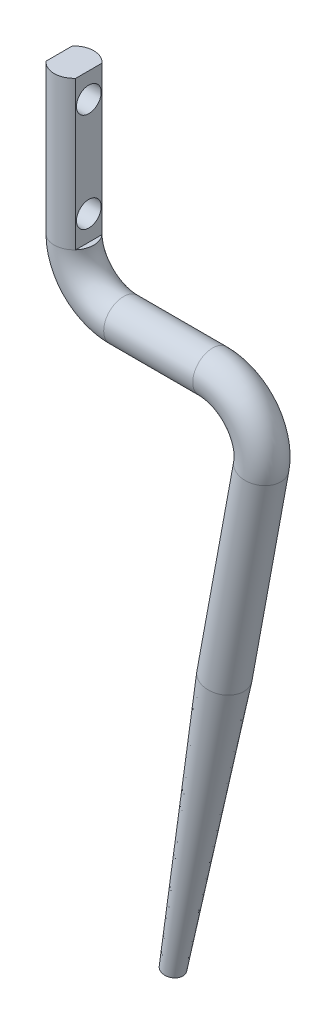
ISO-10303-21;
HEADER;
FILE_DESCRIPTION(('STEP AP214'),'2;1');
FILE_NAME('part.step','',(''),(''),'','','');
FILE_SCHEMA(('AUTOMOTIVE_DESIGN { 1 0 10303 214 1 1 1 1 }'));
ENDSEC;
DATA;
#1=APPLICATION_CONTEXT('core data for automotive mechanical design processes');
#2=APPLICATION_PROTOCOL_DEFINITION('international standard','automotive_design',2000,#1);
#3=PRODUCT_CONTEXT('',#1,'mechanical');
#4=PRODUCT('Part','Part','',(#3));
#5=PRODUCT_RELATED_PRODUCT_CATEGORY('part','',(#4));
#6=PRODUCT_DEFINITION_FORMATION('','',#4);
#7=PRODUCT_DEFINITION_CONTEXT('part definition',#1,'design');
#8=PRODUCT_DEFINITION('design','',#6,#7);
#9=PRODUCT_DEFINITION_SHAPE('','',#8);
#10=(LENGTH_UNIT() NAMED_UNIT(*) SI_UNIT(.MILLI.,.METRE.));
#11=(NAMED_UNIT(*) PLANE_ANGLE_UNIT() SI_UNIT($,.RADIAN.));
#12=(NAMED_UNIT(*) SI_UNIT($,.STERADIAN.) SOLID_ANGLE_UNIT());
#13=UNCERTAINTY_MEASURE_WITH_UNIT(LENGTH_MEASURE(1.E-05),#10,'distance_accuracy_value','');
#14=(GEOMETRIC_REPRESENTATION_CONTEXT(3) GLOBAL_UNCERTAINTY_ASSIGNED_CONTEXT((#13)) GLOBAL_UNIT_ASSIGNED_CONTEXT((#10,
#11,#12)) REPRESENTATION_CONTEXT('',''));
#15=CARTESIAN_POINT('',(0.,0.,0.));
#16=DIRECTION('',(0.,0.,1.));
#17=DIRECTION('',(1.,0.,0.));
#18=AXIS2_PLACEMENT_3D('',#15,#16,#17);
#19=CARTESIAN_POINT('',(0.,40.,0.));
#20=DIRECTION('',(0.,1.,0.));
#21=DIRECTION('',(0.,0.,1.));
#22=AXIS2_PLACEMENT_3D('',#19,#20,#21);
#23=PLANE('',#22);
#24=CARTESIAN_POINT('',(0.,40.,0.));
#25=DIRECTION('',(0.,1.,0.));
#26=DIRECTION('',(0.,0.,1.));
#27=AXIS2_PLACEMENT_3D('',#24,#25,#26);
#28=CIRCLE('',#27,4.);
#29=CARTESIAN_POINT('',(3.,40.,-2.64575131106459));
#30=VERTEX_POINT('',#29);
#31=CARTESIAN_POINT('',(-3.,40.,-2.64575131106459));
#32=VERTEX_POINT('',#31);
#33=EDGE_CURVE('E109',#30,#32,#28,.T.);
#34=ORIENTED_EDGE('',*,*,#33,.T.);
#35=DIRECTION('',(0.,0.,1.));
#36=VECTOR('',#35,1.);
#37=CARTESIAN_POINT('',(-3.,40.,-17.7651075584702));
#38=LINE('',#37,#36);
#39=CARTESIAN_POINT('',(-3.,40.,2.64575131106459));
#40=VERTEX_POINT('',#39);
#41=EDGE_CURVE('E94',#32,#40,#38,.T.);
#42=ORIENTED_EDGE('',*,*,#41,.T.);
#43=CARTESIAN_POINT('',(0.,40.,4.));
#44=VERTEX_POINT('',#43);
#45=EDGE_CURVE('E108',#40,#44,#28,.T.);
#46=ORIENTED_EDGE('',*,*,#45,.T.);
#47=CARTESIAN_POINT('',(3.,40.,2.64575131106458));
#48=VERTEX_POINT('',#47);
#49=EDGE_CURVE('E101',#44,#48,#28,.T.);
#50=ORIENTED_EDGE('',*,*,#49,.T.);
#51=DIRECTION('',(0.,0.,-1.));
#52=VECTOR('',#51,1.);
#53=CARTESIAN_POINT('',(3.,40.,-17.7651075584702));
#54=LINE('',#53,#52);
#55=EDGE_CURVE('E83',#48,#30,#54,.T.);
#56=ORIENTED_EDGE('',*,*,#55,.T.);
#57=EDGE_LOOP('',(#34,#42,#46,#50,#56));
#58=FACE_BOUND('',#57,.T.);
#59=ADVANCED_FACE('F40',(#58),#23,.T.);
#60=CARTESIAN_POINT('',(0.,40.,0.));
#61=DIRECTION('',(0.,-1.,0.));
#62=DIRECTION('',(0.,0.,-1.));
#63=AXIS2_PLACEMENT_3D('',#60,#61,#62);
#64=CYLINDRICAL_SURFACE('',#63,4.);
#65=DIRECTION('',(0.,-1.,0.));
#66=VECTOR('',#65,1.);
#67=CARTESIAN_POINT('',(-3.,40.,-2.64575131106459));
#68=LINE('',#67,#66);
#69=CARTESIAN_POINT('',(-3.,10.0000000000001,-2.64575131106459));
#70=VERTEX_POINT('',#69);
#71=EDGE_CURVE('E115',#32,#70,#68,.T.);
#72=ORIENTED_EDGE('',*,*,#71,.F.);
#73=ORIENTED_EDGE('',*,*,#33,.F.);
#74=DIRECTION('',(0.,-1.,0.));
#75=VECTOR('',#74,1.);
#76=CARTESIAN_POINT('',(3.,40.,-2.64575131106459));
#77=LINE('',#76,#75);
#78=CARTESIAN_POINT('',(3.,10.,-2.64575131106427));
#79=VERTEX_POINT('',#78);
#80=EDGE_CURVE('E89',#79,#30,#77,.F.);
#81=ORIENTED_EDGE('',*,*,#80,.F.);
#82=CARTESIAN_POINT('',(0.,10.0000000000001,0.));
#83=DIRECTION('',(0.,1.,0.));
#84=DIRECTION('',(0.,0.,1.));
#85=AXIS2_PLACEMENT_3D('',#82,#83,#84);
#86=CIRCLE('',#85,4.);
#87=EDGE_CURVE('E202',#79,#70,#86,.T.);
#88=ORIENTED_EDGE('',*,*,#87,.T.);
#89=EDGE_LOOP('',(#72,#73,#81,#88));
#90=FACE_BOUND('',#89,.T.);
#91=ADVANCED_FACE('F156',(#90),#64,.T.);
#92=DIRECTION('',(0.,-1.,0.));
#93=VECTOR('',#92,1.);
#94=CARTESIAN_POINT('',(-3.,40.,2.64575131106459));
#95=LINE('',#94,#93);
#96=CARTESIAN_POINT('',(-3.,10.,2.64575131106491));
#97=VERTEX_POINT('',#96);
#98=EDGE_CURVE('E105',#97,#40,#95,.F.);
#99=ORIENTED_EDGE('',*,*,#98,.F.);
#100=CARTESIAN_POINT('',(3.,10.0000000000001,2.64575131106459));
#101=VERTEX_POINT('',#100);
#102=EDGE_CURVE('E103',#97,#101,#86,.T.);
#103=ORIENTED_EDGE('',*,*,#102,.T.);
#104=DIRECTION('',(0.,-1.,0.));
#105=VECTOR('',#104,1.);
#106=CARTESIAN_POINT('',(3.,40.,2.64575131106459));
#107=LINE('',#106,#105);
#108=EDGE_CURVE('E86',#48,#101,#107,.T.);
#109=ORIENTED_EDGE('',*,*,#108,.F.);
#110=ORIENTED_EDGE('',*,*,#49,.F.);
#111=ORIENTED_EDGE('',*,*,#45,.F.);
#112=EDGE_LOOP('',(#99,#103,#109,#110,#111));
#113=FACE_BOUND('',#112,.T.);
#114=ADVANCED_FACE('F99',(#113),#64,.T.);
#115=CARTESIAN_POINT('',(20.,-108.5,0.));
#116=DIRECTION('',(0.181277775777393,0.983431933592357,0.));
#117=DIRECTION('',(0.,0.,1.));
#118=AXIS2_PLACEMENT_3D('',#115,#116,#117);
#119=PLANE('',#118);
#120=CARTESIAN_POINT('',(20.,-108.5,0.));
#121=DIRECTION('',(0.181277775777393,0.983431933592357,0.));
#122=DIRECTION('',(-0.983431933592357,0.181277775777393,0.));
#123=AXIS2_PLACEMENT_3D('',#120,#121,#122);
#124=CIRCLE('',#123,2.00000000000123);
#125=CARTESIAN_POINT('',(18.0331361328141,-108.137444448445,0.));
#126=VERTEX_POINT('',#125);
#127=EDGE_CURVE('E12',#126,#126,#124,.F.);
#128=ORIENTED_EDGE('',*,*,#127,.T.);
#129=EDGE_LOOP('',(#128));
#130=FACE_BOUND('',#129,.T.);
#131=ADVANCED_FACE('F163',(#130),#119,.F.);
#132=CARTESIAN_POINT('',(10.,10.,0.));
#133=DIRECTION('',(0.,0.,1.));
#134=DIRECTION('',(1.,0.,0.));
#135=AXIS2_PLACEMENT_3D('',#132,#133,#134);
#136=TOROIDAL_SURFACE('',#135,10.0000000000003,4.);
#137=CARTESIAN_POINT('',(10.0000000000001,0.,0.));
#138=DIRECTION('',(-1.,0.,0.));
#139=DIRECTION('',(0.,0.,1.));
#140=AXIS2_PLACEMENT_3D('',#137,#138,#139);
#141=CIRCLE('',#140,4.);
#142=CARTESIAN_POINT('',(10.0000000000001,0.,4.));
#143=VERTEX_POINT('',#142);
#144=EDGE_CURVE('E203',#143,#143,#141,.T.);
#145=ORIENTED_EDGE('',*,*,#144,.T.);
#146=EDGE_LOOP('',(#145));
#147=FACE_BOUND('',#146,.T.);
#148=EDGE_CURVE('E113',#101,#79,#86,.T.);
#149=ORIENTED_EDGE('',*,*,#148,.F.);
#150=ORIENTED_EDGE('',*,*,#102,.F.);
#151=EDGE_CURVE('E111',#70,#97,#86,.T.);
#152=ORIENTED_EDGE('',*,*,#151,.F.);
#153=ORIENTED_EDGE('',*,*,#87,.F.);
#154=EDGE_LOOP('',(#149,#150,#152,#153));
#155=FACE_BOUND('',#154,.T.);
#156=ADVANCED_FACE('F166',(#147,#155),#136,.T.);
#157=CARTESIAN_POINT('',(10.0000000000001,0.,0.));
#158=DIRECTION('',(1.,0.,0.));
#159=DIRECTION('',(0.,0.,-1.));
#160=AXIS2_PLACEMENT_3D('',#157,#158,#159);
#161=CYLINDRICAL_SURFACE('',#160,4.);
#162=CARTESIAN_POINT('',(27.9882101096481,0.,0.));
#163=DIRECTION('',(-1.,0.,0.));
#164=DIRECTION('',(0.,0.,1.));
#165=AXIS2_PLACEMENT_3D('',#162,#163,#164);
#166=CIRCLE('',#165,4.);
#167=CARTESIAN_POINT('',(27.9882101096481,4.,0.));
#168=VERTEX_POINT('',#167);
#169=EDGE_CURVE('E205',#168,#168,#166,.T.);
#170=ORIENTED_EDGE('',*,*,#169,.T.);
#171=EDGE_LOOP('',(#170));
#172=FACE_BOUND('',#171,.T.);
#173=ORIENTED_EDGE('',*,*,#144,.F.);
#174=EDGE_LOOP('',(#173));
#175=FACE_BOUND('',#174,.T.);
#176=ADVANCED_FACE('F175',(#172,#175),#161,.T.);
#177=CARTESIAN_POINT('',(27.9882101096481,-10.,0.));
#178=DIRECTION('',(0.,0.,-1.));
#179=DIRECTION('',(-1.,0.,0.));
#180=AXIS2_PLACEMENT_3D('',#177,#178,#179);
#181=TOROIDAL_SURFACE('',#180,10.,4.);
#182=CARTESIAN_POINT('',(37.8225294455716,-11.8127777577739,0.));
#183=DIRECTION('',(0.181277775777392,0.983431933592357,0.));
#184=DIRECTION('',(0.,0.,1.));
#185=AXIS2_PLACEMENT_3D('',#182,#183,#184);
#186=CIRCLE('',#185,4.);
#187=CARTESIAN_POINT('',(41.7562571799411,-12.5378888608835,0.));
#188=VERTEX_POINT('',#187);
#189=EDGE_CURVE('E210',#188,#188,#186,.T.);
#190=CARTESIAN_POINT('',(27.9882101096481,-10.,0.));
#191=DIRECTION('',(0.,0.,-1.));
#192=DIRECTION('',(-1.,0.,0.));
#193=AXIS2_PLACEMENT_3D('',#190,#191,#192);
#194=CIRCLE('',#193,14.);
#195=EDGE_CURVE('',#168,#188,#194,.T.);
#196=ORIENTED_EDGE('',*,*,#169,.F.);
#197=ORIENTED_EDGE('',*,*,#189,.T.);
#198=ORIENTED_EDGE('',*,*,#195,.T.);
#199=ORIENTED_EDGE('',*,*,#195,.F.);
#200=EDGE_LOOP('',(#196,#198,#197,#199));
#201=FACE_BOUND('',#200,.T.);
#202=ADVANCED_FACE('F171',(#201),#181,.T.);
#203=CARTESIAN_POINT('',(37.8225294455716,-11.8127777577739,0.));
#204=DIRECTION('',(-0.181277775777393,-0.983431933592357,0.));
#205=DIRECTION('',(0.983431933592357,-0.181277775777393,0.));
#206=AXIS2_PLACEMENT_3D('',#203,#204,#205);
#207=CYLINDRICAL_SURFACE('',#206,4.);
#208=CARTESIAN_POINT('',(30.3822326034445,-52.1763881263139,0.));
#209=DIRECTION('',(0.181277775777393,0.983431933592357,0.));
#210=DIRECTION('',(-0.983431933592357,0.181277775777393,0.));
#211=AXIS2_PLACEMENT_3D('',#208,#209,#210);
#212=CIRCLE('',#211,4.);
#213=CARTESIAN_POINT('',(26.448504869075,-51.4512770232043,0.));
#214=VERTEX_POINT('',#213);
#215=EDGE_CURVE('E48',#214,#214,#212,.T.);
#216=ORIENTED_EDGE('',*,*,#215,.T.);
#217=EDGE_LOOP('',(#216));
#218=FACE_BOUND('',#217,.T.);
#219=ORIENTED_EDGE('',*,*,#189,.F.);
#220=EDGE_LOOP('',(#219));
#221=FACE_BOUND('',#220,.T.);
#222=ADVANCED_FACE('F168',(#218,#221),#207,.T.);
#223=CARTESIAN_POINT('',(30.3822326034445,-52.1763881263139,0.));
#224=DIRECTION('',(0.181277775777393,0.983431933592357,0.));
#225=DIRECTION('',(-0.983431933592357,0.181277775777393,0.));
#226=AXIS2_PLACEMENT_3D('',#223,#224,#225);
#227=CONICAL_SURFACE('',#226,4.,0.0349065850398838);
#228=ORIENTED_EDGE('',*,*,#127,.F.);
#229=EDGE_LOOP('',(#228));
#230=FACE_BOUND('',#229,.T.);
#231=ORIENTED_EDGE('',*,*,#215,.F.);
#232=EDGE_LOOP('',(#231));
#233=FACE_BOUND('',#232,.T.);
#234=ADVANCED_FACE('F42',(#230,#233),#227,.T.);
#235=CARTESIAN_POINT('',(18.994105054824,10.,0.));
#236=DIRECTION('',(0.,1.,0.));
#237=DIRECTION('',(0.,0.,1.));
#238=AXIS2_PLACEMENT_3D('',#235,#236,#237);
#239=PLANE('',#238);
#240=ORIENTED_EDGE('',*,*,#151,.T.);
#241=DIRECTION('',(0.,0.,1.));
#242=VECTOR('',#241,1.);
#243=CARTESIAN_POINT('',(-3.,10.,-17.7651075584702));
#244=LINE('',#243,#242);
#245=EDGE_CURVE('E54',#70,#97,#244,.T.);
#246=ORIENTED_EDGE('',*,*,#245,.F.);
#247=EDGE_LOOP('',(#240,#246));
#248=FACE_BOUND('',#247,.T.);
#249=ADVANCED_FACE('F186',(#248),#239,.T.);
#250=CARTESIAN_POINT('',(-3.,10.,-17.7651075584702));
#251=DIRECTION('',(-1.,0.,0.));
#252=DIRECTION('',(0.,0.,1.));
#253=AXIS2_PLACEMENT_3D('',#250,#251,#252);
#254=PLANE('',#253);
#255=CARTESIAN_POINT('',(-3.,35.0000000000001,0.));
#256=DIRECTION('',(-1.,0.,0.));
#257=DIRECTION('',(0.,0.,1.));
#258=AXIS2_PLACEMENT_3D('',#255,#256,#257);
#259=CIRCLE('',#258,2.49999999999999);
#260=CARTESIAN_POINT('',(-3.,35.0000000000001,2.49999999999999));
#261=VERTEX_POINT('',#260);
#262=EDGE_CURVE('E131',#261,#261,#259,.T.);
#263=ORIENTED_EDGE('',*,*,#262,.F.);
#264=EDGE_LOOP('',(#263));
#265=FACE_BOUND('',#264,.T.);
#266=CARTESIAN_POINT('',(-3.,15.0000000000001,0.));
#267=DIRECTION('',(-1.,0.,0.));
#268=DIRECTION('',(0.,0.,1.));
#269=AXIS2_PLACEMENT_3D('',#266,#267,#268);
#270=CIRCLE('',#269,2.49999999999999);
#271=CARTESIAN_POINT('',(-3.,15.0000000000001,2.49999999999999));
#272=VERTEX_POINT('',#271);
#273=EDGE_CURVE('E123',#272,#272,#270,.T.);
#274=ORIENTED_EDGE('',*,*,#273,.F.);
#275=EDGE_LOOP('',(#274));
#276=FACE_BOUND('',#275,.T.);
#277=ORIENTED_EDGE('',*,*,#71,.T.);
#278=ORIENTED_EDGE('',*,*,#245,.T.);
#279=ORIENTED_EDGE('',*,*,#98,.T.);
#280=ORIENTED_EDGE('',*,*,#41,.F.);
#281=EDGE_LOOP('',(#277,#278,#279,#280));
#282=FACE_BOUND('',#281,.T.);
#283=ADVANCED_FACE('F185',(#265,#276,#282),#254,.T.);
#284=ORIENTED_EDGE('',*,*,#148,.T.);
#285=DIRECTION('',(0.,0.,-1.));
#286=VECTOR('',#285,1.);
#287=CARTESIAN_POINT('',(3.,10.,-17.7651075584702));
#288=LINE('',#287,#286);
#289=EDGE_CURVE('E61',#101,#79,#288,.T.);
#290=ORIENTED_EDGE('',*,*,#289,.F.);
#291=EDGE_LOOP('',(#284,#290));
#292=FACE_BOUND('',#291,.T.);
#293=ADVANCED_FACE('F143',(#292),#239,.T.);
#294=CARTESIAN_POINT('',(3.,10.,-17.7651075584702));
#295=DIRECTION('',(1.,0.,0.));
#296=DIRECTION('',(0.,0.,-1.));
#297=AXIS2_PLACEMENT_3D('',#294,#295,#296);
#298=PLANE('',#297);
#299=CARTESIAN_POINT('',(3.,35.0000000000001,0.));
#300=DIRECTION('',(1.,0.,0.));
#301=DIRECTION('',(0.,0.,-1.));
#302=AXIS2_PLACEMENT_3D('',#299,#300,#301);
#303=CIRCLE('',#302,2.49999999999999);
#304=CARTESIAN_POINT('',(3.,35.0000000000001,-2.49999999999999));
#305=VERTEX_POINT('',#304);
#306=EDGE_CURVE('E134',#305,#305,#303,.T.);
#307=ORIENTED_EDGE('',*,*,#306,.F.);
#308=EDGE_LOOP('',(#307));
#309=FACE_BOUND('',#308,.T.);
#310=CARTESIAN_POINT('',(3.,15.0000000000001,0.));
#311=DIRECTION('',(1.,0.,0.));
#312=DIRECTION('',(0.,0.,-1.));
#313=AXIS2_PLACEMENT_3D('',#310,#311,#312);
#314=CIRCLE('',#313,2.49999999999999);
#315=CARTESIAN_POINT('',(3.,15.0000000000001,-2.49999999999999));
#316=VERTEX_POINT('',#315);
#317=EDGE_CURVE('E128',#316,#316,#314,.T.);
#318=ORIENTED_EDGE('',*,*,#317,.F.);
#319=EDGE_LOOP('',(#318));
#320=FACE_BOUND('',#319,.T.);
#321=ORIENTED_EDGE('',*,*,#108,.T.);
#322=ORIENTED_EDGE('',*,*,#289,.T.);
#323=ORIENTED_EDGE('',*,*,#80,.T.);
#324=ORIENTED_EDGE('',*,*,#55,.F.);
#325=EDGE_LOOP('',(#321,#322,#323,#324));
#326=FACE_BOUND('',#325,.T.);
#327=ADVANCED_FACE('F85',(#309,#320,#326),#298,.T.);
#328=CARTESIAN_POINT('',(3.,15.0000000000001,0.));
#329=DIRECTION('',(1.,0.,0.));
#330=DIRECTION('',(0.,0.,-1.));
#331=AXIS2_PLACEMENT_3D('',#328,#329,#330);
#332=CYLINDRICAL_SURFACE('',#331,2.49999999999999);
#333=ORIENTED_EDGE('',*,*,#273,.T.);
#334=EDGE_LOOP('',(#333));
#335=FACE_BOUND('',#334,.T.);
#336=ORIENTED_EDGE('',*,*,#317,.T.);
#337=EDGE_LOOP('',(#336));
#338=FACE_BOUND('',#337,.T.);
#339=ADVANCED_FACE('F142',(#335,#338),#332,.F.);
#340=CARTESIAN_POINT('',(3.,35.0000000000001,0.));
#341=DIRECTION('',(1.,0.,0.));
#342=DIRECTION('',(0.,0.,-1.));
#343=AXIS2_PLACEMENT_3D('',#340,#341,#342);
#344=CYLINDRICAL_SURFACE('',#343,2.49999999999999);
#345=ORIENTED_EDGE('',*,*,#262,.T.);
#346=EDGE_LOOP('',(#345));
#347=FACE_BOUND('',#346,.T.);
#348=ORIENTED_EDGE('',*,*,#306,.T.);
#349=EDGE_LOOP('',(#348));
#350=FACE_BOUND('',#349,.T.);
#351=ADVANCED_FACE('F138',(#347,#350),#344,.F.);
#352=CLOSED_SHELL('',(#59,#91,#114,#131,#156,#176,#202,#222,#234,#249,#283,#293,#327,#339,#351));
#353=MANIFOLD_SOLID_BREP('B2',#352);
#354=ADVANCED_BREP_SHAPE_REPRESENTATION('',(#18,#353),#14);
#355=SHAPE_DEFINITION_REPRESENTATION(#9,#354);
ENDSEC;
END-ISO-10303-21;
